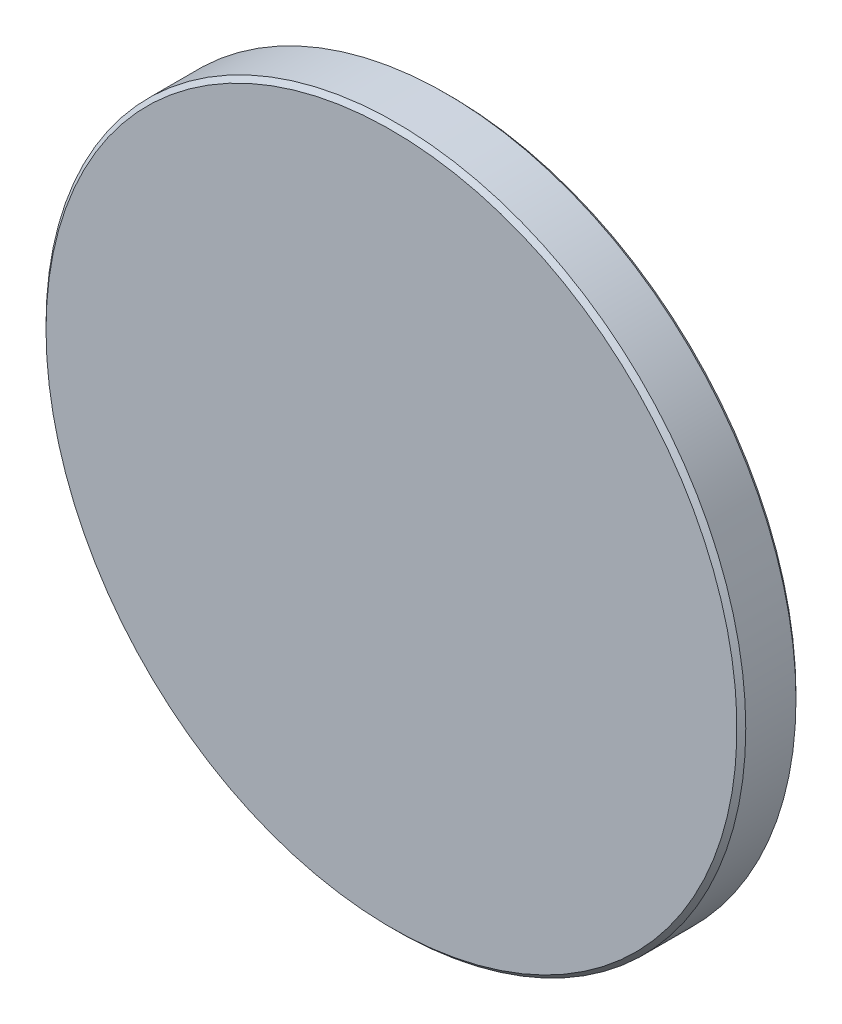
ISO-10303-21;
HEADER;
FILE_DESCRIPTION(('STEP AP214'),'2;1');
FILE_NAME('part.step','',(''),(''),'','','');
FILE_SCHEMA(('AUTOMOTIVE_DESIGN { 1 0 10303 214 1 1 1 1 }'));
ENDSEC;
DATA;
#1=APPLICATION_CONTEXT('core data for automotive mechanical design processes');
#2=APPLICATION_PROTOCOL_DEFINITION('international standard','automotive_design',2000,#1);
#3=PRODUCT_CONTEXT('',#1,'mechanical');
#4=PRODUCT('Part','Part','',(#3));
#5=PRODUCT_RELATED_PRODUCT_CATEGORY('part','',(#4));
#6=PRODUCT_DEFINITION_FORMATION('','',#4);
#7=PRODUCT_DEFINITION_CONTEXT('part definition',#1,'design');
#8=PRODUCT_DEFINITION('design','',#6,#7);
#9=PRODUCT_DEFINITION_SHAPE('','',#8);
#10=(LENGTH_UNIT() NAMED_UNIT(*) SI_UNIT(.MILLI.,.METRE.));
#11=(NAMED_UNIT(*) PLANE_ANGLE_UNIT() SI_UNIT($,.RADIAN.));
#12=(NAMED_UNIT(*) SI_UNIT($,.STERADIAN.) SOLID_ANGLE_UNIT());
#13=UNCERTAINTY_MEASURE_WITH_UNIT(LENGTH_MEASURE(1.E-05),#10,'distance_accuracy_value','');
#14=(GEOMETRIC_REPRESENTATION_CONTEXT(3) GLOBAL_UNCERTAINTY_ASSIGNED_CONTEXT((#13)) GLOBAL_UNIT_ASSIGNED_CONTEXT((#10,
#11,#12)) REPRESENTATION_CONTEXT('',''));
#15=CARTESIAN_POINT('',(0.,0.,0.));
#16=DIRECTION('',(0.,0.,1.));
#17=DIRECTION('',(1.,0.,0.));
#18=AXIS2_PLACEMENT_3D('',#15,#16,#17);
#19=CARTESIAN_POINT('',(0.,0.,4.));
#20=DIRECTION('',(0.,0.,1.));
#21=DIRECTION('',(1.,0.,0.));
#22=AXIS2_PLACEMENT_3D('',#19,#20,#21);
#23=PLANE('',#22);
#24=CARTESIAN_POINT('',(0.,0.,4.));
#25=DIRECTION('',(0.,0.,-1.));
#26=DIRECTION('',(-1.,0.,0.));
#27=AXIS2_PLACEMENT_3D('',#24,#25,#26);
#28=CIRCLE('',#27,23.3943643298969);
#29=CARTESIAN_POINT('',(-23.3943643298969,0.,4.));
#30=VERTEX_POINT('',#29);
#31=EDGE_CURVE('E18',#30,#30,#28,.T.);
#32=ORIENTED_EDGE('',*,*,#31,.F.);
#33=EDGE_LOOP('',(#32));
#34=FACE_BOUND('',#33,.T.);
#35=ADVANCED_FACE('F15',(#34),#23,.T.);
#36=CARTESIAN_POINT('',(0.,0.,3.7));
#37=DIRECTION('',(0.,0.,-1.));
#38=DIRECTION('',(-1.,0.,0.));
#39=AXIS2_PLACEMENT_3D('',#36,#37,#38);
#40=CONICAL_SURFACE('',#39,23.6943643298969,0.78539816339745);
#41=ORIENTED_EDGE('',*,*,#31,.T.);
#42=EDGE_LOOP('',(#41));
#43=FACE_BOUND('',#42,.T.);
#44=CARTESIAN_POINT('',(0.,0.,3.7));
#45=DIRECTION('',(0.,0.,-1.));
#46=DIRECTION('',(-1.,0.,0.));
#47=AXIS2_PLACEMENT_3D('',#44,#45,#46);
#48=CIRCLE('',#47,23.6943643298969);
#49=CARTESIAN_POINT('',(-23.6943643298969,0.,3.7));
#50=VERTEX_POINT('',#49);
#51=EDGE_CURVE('E26',#50,#50,#48,.T.);
#52=ORIENTED_EDGE('',*,*,#51,.F.);
#53=EDGE_LOOP('',(#52));
#54=FACE_BOUND('',#53,.T.);
#55=ADVANCED_FACE('F35',(#43,#54),#40,.T.);
#56=CARTESIAN_POINT('',(0.,0.,4.));
#57=DIRECTION('',(0.,0.,-1.));
#58=DIRECTION('',(-1.,0.,0.));
#59=AXIS2_PLACEMENT_3D('',#56,#57,#58);
#60=CYLINDRICAL_SURFACE('',#59,23.6943643298969);
#61=ORIENTED_EDGE('',*,*,#51,.T.);
#62=EDGE_LOOP('',(#61));
#63=FACE_BOUND('',#62,.T.);
#64=CARTESIAN_POINT('',(0.,0.,0.299999999999995));
#65=DIRECTION('',(0.,0.,1.));
#66=DIRECTION('',(1.,0.,0.));
#67=AXIS2_PLACEMENT_3D('',#64,#65,#66);
#68=CIRCLE('',#67,23.6943643298969);
#69=CARTESIAN_POINT('',(23.6943643298969,0.,0.299999999999996));
#70=VERTEX_POINT('',#69);
#71=EDGE_CURVE('E22',#70,#70,#68,.F.);
#72=ORIENTED_EDGE('',*,*,#71,.F.);
#73=EDGE_LOOP('',(#72));
#74=FACE_BOUND('',#73,.T.);
#75=ADVANCED_FACE('F43',(#63,#74),#60,.T.);
#76=CARTESIAN_POINT('',(0.,0.,0.299999999999995));
#77=DIRECTION('',(0.,0.,1.));
#78=DIRECTION('',(1.,0.,0.));
#79=AXIS2_PLACEMENT_3D('',#76,#77,#78);
#80=CONICAL_SURFACE('',#79,23.6943643298969,0.78539816339746);
#81=CARTESIAN_POINT('',(0.,0.,0.));
#82=DIRECTION('',(0.,0.,1.));
#83=DIRECTION('',(1.,0.,0.));
#84=AXIS2_PLACEMENT_3D('',#81,#82,#83);
#85=CIRCLE('',#84,23.3943643298969);
#86=CARTESIAN_POINT('',(23.3943643298969,0.,0.));
#87=VERTEX_POINT('',#86);
#88=EDGE_CURVE('E10',#87,#87,#85,.T.);
#89=ORIENTED_EDGE('',*,*,#88,.T.);
#90=EDGE_LOOP('',(#89));
#91=FACE_BOUND('',#90,.T.);
#92=ORIENTED_EDGE('',*,*,#71,.T.);
#93=EDGE_LOOP('',(#92));
#94=FACE_BOUND('',#93,.T.);
#95=ADVANCED_FACE('F46',(#91,#94),#80,.T.);
#96=CARTESIAN_POINT('',(0.,0.,0.));
#97=DIRECTION('',(0.,0.,1.));
#98=DIRECTION('',(1.,0.,0.));
#99=AXIS2_PLACEMENT_3D('',#96,#97,#98);
#100=PLANE('',#99);
#101=ORIENTED_EDGE('',*,*,#88,.F.);
#102=EDGE_LOOP('',(#101));
#103=FACE_BOUND('',#102,.T.);
#104=ADVANCED_FACE('F44',(#103),#100,.F.);
#105=CLOSED_SHELL('',(#35,#55,#75,#95,#104));
#106=MANIFOLD_SOLID_BREP('B1',#105);
#107=ADVANCED_BREP_SHAPE_REPRESENTATION('',(#18,#106),#14);
#108=SHAPE_DEFINITION_REPRESENTATION(#9,#107);
ENDSEC;
END-ISO-10303-21;
